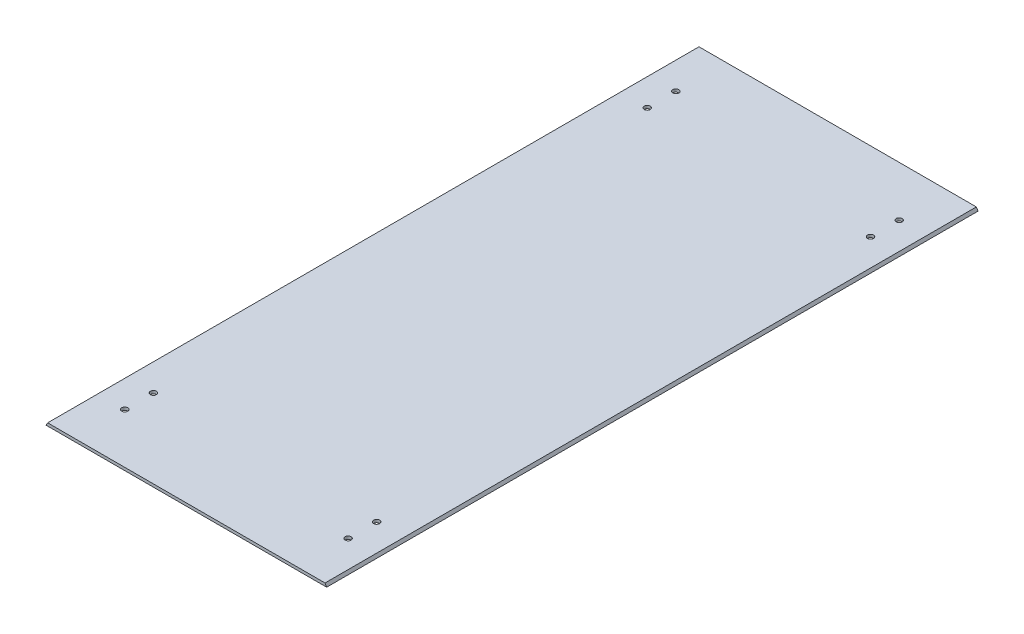
ISO-10303-21;
HEADER;
FILE_DESCRIPTION(('STEP AP214'),'2;1');
FILE_NAME('part.step','',(''),(''),'','','');
FILE_SCHEMA(('AUTOMOTIVE_DESIGN { 1 0 10303 214 1 1 1 1 }'));
ENDSEC;
DATA;
#1=APPLICATION_CONTEXT('core data for automotive mechanical design processes');
#2=APPLICATION_PROTOCOL_DEFINITION('international standard','automotive_design',2000,#1);
#3=PRODUCT_CONTEXT('',#1,'mechanical');
#4=PRODUCT('Part','Part','',(#3));
#5=PRODUCT_RELATED_PRODUCT_CATEGORY('part','',(#4));
#6=PRODUCT_DEFINITION_FORMATION('','',#4);
#7=PRODUCT_DEFINITION_CONTEXT('part definition',#1,'design');
#8=PRODUCT_DEFINITION('design','',#6,#7);
#9=PRODUCT_DEFINITION_SHAPE('','',#8);
#10=(LENGTH_UNIT() NAMED_UNIT(*) SI_UNIT(.MILLI.,.METRE.));
#11=(NAMED_UNIT(*) PLANE_ANGLE_UNIT() SI_UNIT($,.RADIAN.));
#12=(NAMED_UNIT(*) SI_UNIT($,.STERADIAN.) SOLID_ANGLE_UNIT());
#13=UNCERTAINTY_MEASURE_WITH_UNIT(LENGTH_MEASURE(1.E-05),#10,'distance_accuracy_value','');
#14=(GEOMETRIC_REPRESENTATION_CONTEXT(3) GLOBAL_UNCERTAINTY_ASSIGNED_CONTEXT((#13)) GLOBAL_UNIT_ASSIGNED_CONTEXT((#10,
#11,#12)) REPRESENTATION_CONTEXT('',''));
#15=CARTESIAN_POINT('',(0.,0.,0.));
#16=DIRECTION('',(0.,0.,1.));
#17=DIRECTION('',(1.,0.,0.));
#18=AXIS2_PLACEMENT_3D('',#15,#16,#17);
#19=CARTESIAN_POINT('',(-98.,-1.,-455.));
#20=DIRECTION('',(0.,-1.,0.));
#21=DIRECTION('',(0.,0.,-1.));
#22=AXIS2_PLACEMENT_3D('',#19,#20,#21);
#23=PLANE('',#22);
#24=CARTESIAN_POINT('',(78.,-1.,-420.));
#25=DIRECTION('',(0.,-1.,0.));
#26=DIRECTION('',(0.,0.,-1.));
#27=AXIS2_PLACEMENT_3D('',#24,#25,#26);
#28=CIRCLE('',#27,2.1);
#29=CARTESIAN_POINT('',(78.,-1.,-422.1));
#30=VERTEX_POINT('',#29);
#31=EDGE_CURVE('E156',#30,#30,#28,.T.);
#32=ORIENTED_EDGE('',*,*,#31,.F.);
#33=EDGE_LOOP('',(#32));
#34=FACE_BOUND('',#33,.T.);
#35=CARTESIAN_POINT('',(78.,-1.,-35.));
#36=DIRECTION('',(0.,-1.,0.));
#37=DIRECTION('',(0.,0.,1.));
#38=AXIS2_PLACEMENT_3D('',#35,#36,#37);
#39=CIRCLE('',#38,2.1);
#40=CARTESIAN_POINT('',(78.,-1.,-32.9));
#41=VERTEX_POINT('',#40);
#42=EDGE_CURVE('E147',#41,#41,#39,.T.);
#43=ORIENTED_EDGE('',*,*,#42,.F.);
#44=EDGE_LOOP('',(#43));
#45=FACE_BOUND('',#44,.T.);
#46=CARTESIAN_POINT('',(78.,-1.,-55.));
#47=DIRECTION('',(0.,-1.,0.));
#48=DIRECTION('',(0.,0.,1.));
#49=AXIS2_PLACEMENT_3D('',#46,#47,#48);
#50=CIRCLE('',#49,2.1);
#51=CARTESIAN_POINT('',(78.,-1.,-52.9));
#52=VERTEX_POINT('',#51);
#53=EDGE_CURVE('E174',#52,#52,#50,.T.);
#54=ORIENTED_EDGE('',*,*,#53,.F.);
#55=EDGE_LOOP('',(#54));
#56=FACE_BOUND('',#55,.T.);
#57=CARTESIAN_POINT('',(-78.,-1.,-55.));
#58=DIRECTION('',(0.,-1.,0.));
#59=DIRECTION('',(0.,0.,-1.));
#60=AXIS2_PLACEMENT_3D('',#57,#58,#59);
#61=CIRCLE('',#60,2.1);
#62=CARTESIAN_POINT('',(-78.,-1.,-57.1));
#63=VERTEX_POINT('',#62);
#64=EDGE_CURVE('E165',#63,#63,#61,.T.);
#65=ORIENTED_EDGE('',*,*,#64,.F.);
#66=EDGE_LOOP('',(#65));
#67=FACE_BOUND('',#66,.T.);
#68=CARTESIAN_POINT('',(78.,-1.,-400.));
#69=DIRECTION('',(0.,-1.,0.));
#70=DIRECTION('',(0.,0.,-1.));
#71=AXIS2_PLACEMENT_3D('',#68,#69,#70);
#72=CIRCLE('',#71,2.1);
#73=CARTESIAN_POINT('',(78.,-1.,-402.1));
#74=VERTEX_POINT('',#73);
#75=EDGE_CURVE('E164',#74,#74,#72,.T.);
#76=ORIENTED_EDGE('',*,*,#75,.F.);
#77=EDGE_LOOP('',(#76));
#78=FACE_BOUND('',#77,.T.);
#79=CARTESIAN_POINT('',(-78.,-1.,-400.));
#80=DIRECTION('',(0.,-1.,0.));
#81=DIRECTION('',(0.,0.,1.));
#82=AXIS2_PLACEMENT_3D('',#79,#80,#81);
#83=CIRCLE('',#82,2.1);
#84=CARTESIAN_POINT('',(-78.,-1.,-397.9));
#85=VERTEX_POINT('',#84);
#86=EDGE_CURVE('E143',#85,#85,#83,.T.);
#87=ORIENTED_EDGE('',*,*,#86,.F.);
#88=EDGE_LOOP('',(#87));
#89=FACE_BOUND('',#88,.T.);
#90=CARTESIAN_POINT('',(-78.,-1.,-420.));
#91=DIRECTION('',(0.,-1.,0.));
#92=DIRECTION('',(0.,0.,1.));
#93=AXIS2_PLACEMENT_3D('',#90,#91,#92);
#94=CIRCLE('',#93,2.1);
#95=CARTESIAN_POINT('',(-78.,-1.,-417.9));
#96=VERTEX_POINT('',#95);
#97=EDGE_CURVE('E134',#96,#96,#94,.T.);
#98=ORIENTED_EDGE('',*,*,#97,.F.);
#99=EDGE_LOOP('',(#98));
#100=FACE_BOUND('',#99,.T.);
#101=CARTESIAN_POINT('',(-78.,-1.,-35.));
#102=DIRECTION('',(0.,-1.,0.));
#103=DIRECTION('',(0.,0.,-1.));
#104=AXIS2_PLACEMENT_3D('',#101,#102,#103);
#105=CIRCLE('',#104,2.1);
#106=CARTESIAN_POINT('',(-78.,-1.,-37.1));
#107=VERTEX_POINT('',#106);
#108=EDGE_CURVE('E169',#107,#107,#105,.T.);
#109=ORIENTED_EDGE('',*,*,#108,.F.);
#110=EDGE_LOOP('',(#109));
#111=FACE_BOUND('',#110,.T.);
#112=DIRECTION('',(1.,0.,0.));
#113=VECTOR('',#112,1.);
#114=CARTESIAN_POINT('',(-98.,-1.,0.));
#115=LINE('',#114,#113);
#116=CARTESIAN_POINT('',(-98.,-1.,0.));
#117=VERTEX_POINT('',#116);
#118=CARTESIAN_POINT('',(98.07,-1.,0.));
#119=VERTEX_POINT('',#118);
#120=EDGE_CURVE('E118',#117,#119,#115,.T.);
#121=ORIENTED_EDGE('',*,*,#120,.F.);
#122=DIRECTION('',(0.,0.,1.));
#123=VECTOR('',#122,1.);
#124=CARTESIAN_POINT('',(-98.,-1.,-455.));
#125=LINE('',#124,#123);
#126=CARTESIAN_POINT('',(-98.,-1.,-455.));
#127=VERTEX_POINT('',#126);
#128=EDGE_CURVE('E11',#127,#117,#125,.T.);
#129=ORIENTED_EDGE('',*,*,#128,.F.);
#130=DIRECTION('',(1.,0.,0.));
#131=VECTOR('',#130,1.);
#132=CARTESIAN_POINT('',(-98.,-1.,-455.));
#133=LINE('',#132,#131);
#134=CARTESIAN_POINT('',(98.07,-1.,-455.));
#135=VERTEX_POINT('',#134);
#136=EDGE_CURVE('E107',#127,#135,#133,.T.);
#137=ORIENTED_EDGE('',*,*,#136,.T.);
#138=DIRECTION('',(0.,0.,1.));
#139=VECTOR('',#138,1.);
#140=CARTESIAN_POINT('',(98.07,-1.,-455.));
#141=LINE('',#140,#139);
#142=EDGE_CURVE('E48',#135,#119,#141,.T.);
#143=ORIENTED_EDGE('',*,*,#142,.T.);
#144=EDGE_LOOP('',(#121,#129,#137,#143));
#145=FACE_BOUND('',#144,.T.);
#146=ADVANCED_FACE('F45',(#34,#45,#56,#67,#78,#89,#100,#111,#145),#23,.T.);
#147=CARTESIAN_POINT('',(-98.,-1.,-455.));
#148=DIRECTION('',(-0.866025403784441,0.499999999999996,0.));
#149=DIRECTION('',(-0.499999999999996,-0.866025403784441,0.));
#150=AXIS2_PLACEMENT_3D('',#147,#148,#149);
#151=PLANE('',#150);
#152=DIRECTION('',(-0.499999999999996,-0.866025403784441,0.));
#153=VECTOR('',#152,1.);
#154=CARTESIAN_POINT('',(-98.,-1.,0.));
#155=LINE('',#154,#153);
#156=CARTESIAN_POINT('',(-96.8452994616208,1.,0.));
#157=VERTEX_POINT('',#156);
#158=EDGE_CURVE('E112',#157,#117,#155,.T.);
#159=ORIENTED_EDGE('',*,*,#158,.F.);
#160=DIRECTION('',(0.,0.,1.));
#161=VECTOR('',#160,1.);
#162=CARTESIAN_POINT('',(-96.8452994616208,1.,-455.));
#163=LINE('',#162,#161);
#164=CARTESIAN_POINT('',(-96.8452994616208,1.,-455.));
#165=VERTEX_POINT('',#164);
#166=EDGE_CURVE('E55',#165,#157,#163,.T.);
#167=ORIENTED_EDGE('',*,*,#166,.F.);
#168=DIRECTION('',(-0.499999999999996,-0.866025403784441,0.));
#169=VECTOR('',#168,1.);
#170=CARTESIAN_POINT('',(-98.,-1.,-455.));
#171=LINE('',#170,#169);
#172=EDGE_CURVE('E102',#165,#127,#171,.T.);
#173=ORIENTED_EDGE('',*,*,#172,.T.);
#174=ORIENTED_EDGE('',*,*,#128,.T.);
#175=EDGE_LOOP('',(#159,#167,#173,#174));
#176=FACE_BOUND('',#175,.T.);
#177=ADVANCED_FACE('F190',(#176),#151,.T.);
#178=CARTESIAN_POINT('',(-96.8452994616208,1.,-455.));
#179=DIRECTION('',(0.,1.,0.));
#180=DIRECTION('',(0.,0.,1.));
#181=AXIS2_PLACEMENT_3D('',#178,#179,#180);
#182=PLANE('',#181);
#183=CARTESIAN_POINT('',(78.,1.,-420.));
#184=DIRECTION('',(0.,-1.,0.));
#185=DIRECTION('',(0.,0.,-1.));
#186=AXIS2_PLACEMENT_3D('',#183,#184,#185);
#187=CIRCLE('',#186,2.1);
#188=CARTESIAN_POINT('',(78.,1.,-422.1));
#189=VERTEX_POINT('',#188);
#190=EDGE_CURVE('E160',#189,#189,#187,.T.);
#191=ORIENTED_EDGE('',*,*,#190,.T.);
#192=EDGE_LOOP('',(#191));
#193=FACE_BOUND('',#192,.T.);
#194=CARTESIAN_POINT('',(78.,1.,-35.));
#195=DIRECTION('',(0.,-1.,0.));
#196=DIRECTION('',(0.,0.,1.));
#197=AXIS2_PLACEMENT_3D('',#194,#195,#196);
#198=CIRCLE('',#197,2.1);
#199=CARTESIAN_POINT('',(78.,1.,-32.9));
#200=VERTEX_POINT('',#199);
#201=EDGE_CURVE('E152',#200,#200,#198,.T.);
#202=ORIENTED_EDGE('',*,*,#201,.T.);
#203=EDGE_LOOP('',(#202));
#204=FACE_BOUND('',#203,.T.);
#205=CARTESIAN_POINT('',(78.,1.,-55.));
#206=DIRECTION('',(0.,-1.,0.));
#207=DIRECTION('',(0.,0.,1.));
#208=AXIS2_PLACEMENT_3D('',#205,#206,#207);
#209=CIRCLE('',#208,2.1);
#210=CARTESIAN_POINT('',(78.,1.,-52.9));
#211=VERTEX_POINT('',#210);
#212=EDGE_CURVE('E151',#211,#211,#209,.T.);
#213=ORIENTED_EDGE('',*,*,#212,.T.);
#214=EDGE_LOOP('',(#213));
#215=FACE_BOUND('',#214,.T.);
#216=CARTESIAN_POINT('',(-78.,1.,-55.));
#217=DIRECTION('',(0.,-1.,0.));
#218=DIRECTION('',(0.,0.,-1.));
#219=AXIS2_PLACEMENT_3D('',#216,#217,#218);
#220=CIRCLE('',#219,2.1);
#221=CARTESIAN_POINT('',(-78.,1.,-57.1));
#222=VERTEX_POINT('',#221);
#223=EDGE_CURVE('E170',#222,#222,#220,.T.);
#224=ORIENTED_EDGE('',*,*,#223,.T.);
#225=EDGE_LOOP('',(#224));
#226=FACE_BOUND('',#225,.T.);
#227=CARTESIAN_POINT('',(78.,1.,-400.));
#228=DIRECTION('',(0.,-1.,0.));
#229=DIRECTION('',(0.,0.,-1.));
#230=AXIS2_PLACEMENT_3D('',#227,#228,#229);
#231=CIRCLE('',#230,2.1);
#232=CARTESIAN_POINT('',(78.,1.,-402.1));
#233=VERTEX_POINT('',#232);
#234=EDGE_CURVE('E242',#233,#233,#231,.T.);
#235=ORIENTED_EDGE('',*,*,#234,.T.);
#236=EDGE_LOOP('',(#235));
#237=FACE_BOUND('',#236,.T.);
#238=CARTESIAN_POINT('',(-78.,1.,-400.));
#239=DIRECTION('',(0.,-1.,0.));
#240=DIRECTION('',(0.,0.,1.));
#241=AXIS2_PLACEMENT_3D('',#238,#239,#240);
#242=CIRCLE('',#241,2.1);
#243=CARTESIAN_POINT('',(-78.,1.,-397.9));
#244=VERTEX_POINT('',#243);
#245=EDGE_CURVE('E137',#244,#244,#242,.T.);
#246=ORIENTED_EDGE('',*,*,#245,.T.);
#247=EDGE_LOOP('',(#246));
#248=FACE_BOUND('',#247,.T.);
#249=CARTESIAN_POINT('',(-78.,1.,-420.));
#250=DIRECTION('',(0.,-1.,0.));
#251=DIRECTION('',(0.,0.,1.));
#252=AXIS2_PLACEMENT_3D('',#249,#250,#251);
#253=CIRCLE('',#252,2.1);
#254=CARTESIAN_POINT('',(-78.,1.,-417.9));
#255=VERTEX_POINT('',#254);
#256=EDGE_CURVE('E131',#255,#255,#253,.T.);
#257=ORIENTED_EDGE('',*,*,#256,.T.);
#258=EDGE_LOOP('',(#257));
#259=FACE_BOUND('',#258,.T.);
#260=CARTESIAN_POINT('',(-78.,1.,-35.));
#261=DIRECTION('',(0.,-1.,0.));
#262=DIRECTION('',(0.,0.,-1.));
#263=AXIS2_PLACEMENT_3D('',#260,#261,#262);
#264=CIRCLE('',#263,2.1);
#265=CARTESIAN_POINT('',(-78.,1.,-37.1));
#266=VERTEX_POINT('',#265);
#267=EDGE_CURVE('E122',#266,#266,#264,.T.);
#268=ORIENTED_EDGE('',*,*,#267,.T.);
#269=EDGE_LOOP('',(#268));
#270=FACE_BOUND('',#269,.T.);
#271=DIRECTION('',(-1.,0.,0.));
#272=VECTOR('',#271,1.);
#273=CARTESIAN_POINT('',(-96.8452994616208,1.,0.));
#274=LINE('',#273,#272);
#275=CARTESIAN_POINT('',(96.9152994616207,1.,0.));
#276=VERTEX_POINT('',#275);
#277=EDGE_CURVE('E96',#276,#157,#274,.T.);
#278=ORIENTED_EDGE('',*,*,#277,.F.);
#279=DIRECTION('',(0.,0.,1.));
#280=VECTOR('',#279,1.);
#281=CARTESIAN_POINT('',(96.9152994616207,1.,-455.));
#282=LINE('',#281,#280);
#283=CARTESIAN_POINT('',(96.9152994616207,1.,-455.));
#284=VERTEX_POINT('',#283);
#285=EDGE_CURVE('E91',#284,#276,#282,.T.);
#286=ORIENTED_EDGE('',*,*,#285,.F.);
#287=DIRECTION('',(-1.,0.,0.));
#288=VECTOR('',#287,1.);
#289=CARTESIAN_POINT('',(-96.8452994616208,1.,-455.));
#290=LINE('',#289,#288);
#291=EDGE_CURVE('E94',#284,#165,#290,.T.);
#292=ORIENTED_EDGE('',*,*,#291,.T.);
#293=ORIENTED_EDGE('',*,*,#166,.T.);
#294=EDGE_LOOP('',(#278,#286,#292,#293));
#295=FACE_BOUND('',#294,.T.);
#296=ADVANCED_FACE('F93',(#193,#204,#215,#226,#237,#248,#259,#270,#295),#182,.T.);
#297=CARTESIAN_POINT('',(98.07,-1.,-455.));
#298=DIRECTION('',(0.866025403784441,0.499999999999996,0.));
#299=DIRECTION('',(-0.499999999999996,0.866025403784441,0.));
#300=AXIS2_PLACEMENT_3D('',#297,#298,#299);
#301=PLANE('',#300);
#302=DIRECTION('',(-0.499999999999996,0.866025403784441,0.));
#303=VECTOR('',#302,1.);
#304=CARTESIAN_POINT('',(98.07,-1.,0.));
#305=LINE('',#304,#303);
#306=EDGE_CURVE('E121',#119,#276,#305,.T.);
#307=ORIENTED_EDGE('',*,*,#306,.F.);
#308=ORIENTED_EDGE('',*,*,#142,.F.);
#309=DIRECTION('',(-0.499999999999996,0.866025403784441,0.));
#310=VECTOR('',#309,1.);
#311=CARTESIAN_POINT('',(98.07,-1.,-455.));
#312=LINE('',#311,#310);
#313=EDGE_CURVE('E101',#135,#284,#312,.T.);
#314=ORIENTED_EDGE('',*,*,#313,.T.);
#315=ORIENTED_EDGE('',*,*,#285,.T.);
#316=EDGE_LOOP('',(#307,#308,#314,#315));
#317=FACE_BOUND('',#316,.T.);
#318=ADVANCED_FACE('F105',(#317),#301,.T.);
#319=CARTESIAN_POINT('',(0.,0.,-455.));
#320=DIRECTION('',(0.,0.,1.));
#321=DIRECTION('',(1.,0.,0.));
#322=AXIS2_PLACEMENT_3D('',#319,#320,#321);
#323=PLANE('',#322);
#324=ORIENTED_EDGE('',*,*,#136,.F.);
#325=ORIENTED_EDGE('',*,*,#172,.F.);
#326=ORIENTED_EDGE('',*,*,#291,.F.);
#327=ORIENTED_EDGE('',*,*,#313,.F.);
#328=EDGE_LOOP('',(#324,#325,#326,#327));
#329=FACE_BOUND('',#328,.T.);
#330=ADVANCED_FACE('F100',(#329),#323,.F.);
#331=CARTESIAN_POINT('',(0.,0.,0.));
#332=DIRECTION('',(0.,0.,1.));
#333=DIRECTION('',(1.,0.,0.));
#334=AXIS2_PLACEMENT_3D('',#331,#332,#333);
#335=PLANE('',#334);
#336=ORIENTED_EDGE('',*,*,#120,.T.);
#337=ORIENTED_EDGE('',*,*,#306,.T.);
#338=ORIENTED_EDGE('',*,*,#277,.T.);
#339=ORIENTED_EDGE('',*,*,#158,.T.);
#340=EDGE_LOOP('',(#336,#337,#338,#339));
#341=FACE_BOUND('',#340,.T.);
#342=ADVANCED_FACE('F193',(#341),#335,.T.);
#343=CARTESIAN_POINT('',(-78.,1.,-35.));
#344=DIRECTION('',(0.,-1.,0.));
#345=DIRECTION('',(0.,0.,-1.));
#346=AXIS2_PLACEMENT_3D('',#343,#344,#345);
#347=CYLINDRICAL_SURFACE('',#346,2.1);
#348=ORIENTED_EDGE('',*,*,#267,.F.);
#349=EDGE_LOOP('',(#348));
#350=FACE_BOUND('',#349,.T.);
#351=ORIENTED_EDGE('',*,*,#108,.T.);
#352=EDGE_LOOP('',(#351));
#353=FACE_BOUND('',#352,.T.);
#354=ADVANCED_FACE('F187',(#350,#353),#347,.F.);
#355=CARTESIAN_POINT('',(-78.,1.,-420.));
#356=DIRECTION('',(0.,-1.,0.));
#357=DIRECTION('',(0.,0.,-1.));
#358=AXIS2_PLACEMENT_3D('',#355,#356,#357);
#359=CYLINDRICAL_SURFACE('',#358,2.1);
#360=ORIENTED_EDGE('',*,*,#256,.F.);
#361=EDGE_LOOP('',(#360));
#362=FACE_BOUND('',#361,.T.);
#363=ORIENTED_EDGE('',*,*,#97,.T.);
#364=EDGE_LOOP('',(#363));
#365=FACE_BOUND('',#364,.T.);
#366=ADVANCED_FACE('F210',(#362,#365),#359,.F.);
#367=CARTESIAN_POINT('',(-78.,1.,-400.));
#368=DIRECTION('',(0.,-1.,0.));
#369=DIRECTION('',(0.,0.,-1.));
#370=AXIS2_PLACEMENT_3D('',#367,#368,#369);
#371=CYLINDRICAL_SURFACE('',#370,2.1);
#372=ORIENTED_EDGE('',*,*,#245,.F.);
#373=EDGE_LOOP('',(#372));
#374=FACE_BOUND('',#373,.T.);
#375=ORIENTED_EDGE('',*,*,#86,.T.);
#376=EDGE_LOOP('',(#375));
#377=FACE_BOUND('',#376,.T.);
#378=ADVANCED_FACE('F231',(#374,#377),#371,.F.);
#379=CARTESIAN_POINT('',(78.,1.,-400.));
#380=DIRECTION('',(0.,-1.,0.));
#381=DIRECTION('',(0.,0.,-1.));
#382=AXIS2_PLACEMENT_3D('',#379,#380,#381);
#383=CYLINDRICAL_SURFACE('',#382,2.1);
#384=ORIENTED_EDGE('',*,*,#234,.F.);
#385=EDGE_LOOP('',(#384));
#386=FACE_BOUND('',#385,.T.);
#387=ORIENTED_EDGE('',*,*,#75,.T.);
#388=EDGE_LOOP('',(#387));
#389=FACE_BOUND('',#388,.T.);
#390=ADVANCED_FACE('F220',(#386,#389),#383,.F.);
#391=CARTESIAN_POINT('',(-78.,1.,-55.));
#392=DIRECTION('',(0.,-1.,0.));
#393=DIRECTION('',(0.,0.,-1.));
#394=AXIS2_PLACEMENT_3D('',#391,#392,#393);
#395=CYLINDRICAL_SURFACE('',#394,2.1);
#396=ORIENTED_EDGE('',*,*,#223,.F.);
#397=EDGE_LOOP('',(#396));
#398=FACE_BOUND('',#397,.T.);
#399=ORIENTED_EDGE('',*,*,#64,.T.);
#400=EDGE_LOOP('',(#399));
#401=FACE_BOUND('',#400,.T.);
#402=ADVANCED_FACE('F216',(#398,#401),#395,.F.);
#403=CARTESIAN_POINT('',(78.,1.,-55.));
#404=DIRECTION('',(0.,-1.,0.));
#405=DIRECTION('',(0.,0.,-1.));
#406=AXIS2_PLACEMENT_3D('',#403,#404,#405);
#407=CYLINDRICAL_SURFACE('',#406,2.1);
#408=ORIENTED_EDGE('',*,*,#212,.F.);
#409=EDGE_LOOP('',(#408));
#410=FACE_BOUND('',#409,.T.);
#411=ORIENTED_EDGE('',*,*,#53,.T.);
#412=EDGE_LOOP('',(#411));
#413=FACE_BOUND('',#412,.T.);
#414=ADVANCED_FACE('F212',(#410,#413),#407,.F.);
#415=CARTESIAN_POINT('',(78.,1.,-35.));
#416=DIRECTION('',(0.,-1.,0.));
#417=DIRECTION('',(0.,0.,-1.));
#418=AXIS2_PLACEMENT_3D('',#415,#416,#417);
#419=CYLINDRICAL_SURFACE('',#418,2.1);
#420=ORIENTED_EDGE('',*,*,#201,.F.);
#421=EDGE_LOOP('',(#420));
#422=FACE_BOUND('',#421,.T.);
#423=ORIENTED_EDGE('',*,*,#42,.T.);
#424=EDGE_LOOP('',(#423));
#425=FACE_BOUND('',#424,.T.);
#426=ADVANCED_FACE('F215',(#422,#425),#419,.F.);
#427=CARTESIAN_POINT('',(78.,1.,-420.));
#428=DIRECTION('',(0.,-1.,0.));
#429=DIRECTION('',(0.,0.,-1.));
#430=AXIS2_PLACEMENT_3D('',#427,#428,#429);
#431=CYLINDRICAL_SURFACE('',#430,2.1);
#432=ORIENTED_EDGE('',*,*,#190,.F.);
#433=EDGE_LOOP('',(#432));
#434=FACE_BOUND('',#433,.T.);
#435=ORIENTED_EDGE('',*,*,#31,.T.);
#436=EDGE_LOOP('',(#435));
#437=FACE_BOUND('',#436,.T.);
#438=ADVANCED_FACE('F222',(#434,#437),#431,.F.);
#439=CLOSED_SHELL('',(#146,#177,#296,#318,#330,#342,#354,#366,#378,#390,#402,#414,#426,#438));
#440=MANIFOLD_SOLID_BREP('B2',#439);
#441=ADVANCED_BREP_SHAPE_REPRESENTATION('',(#18,#440),#14);
#442=SHAPE_DEFINITION_REPRESENTATION(#9,#441);
ENDSEC;
END-ISO-10303-21;
